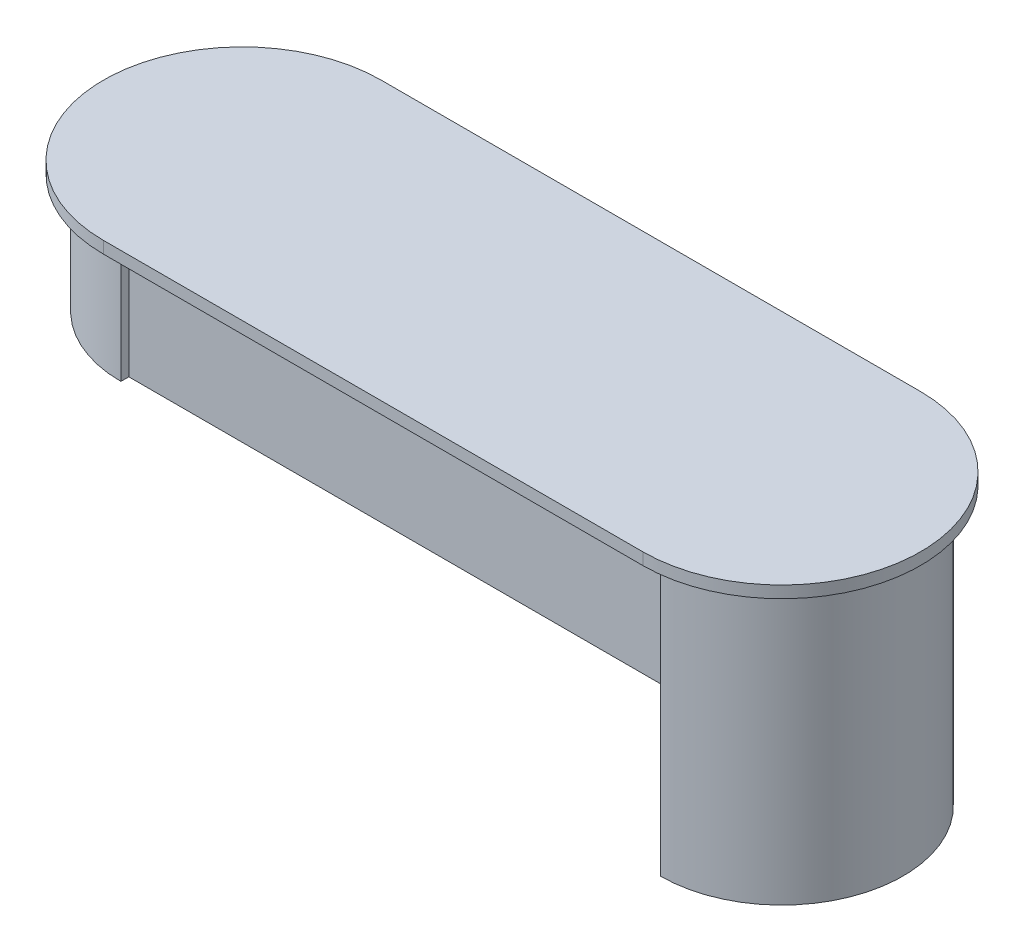
ISO-10303-21;
HEADER;
FILE_DESCRIPTION(('STEP AP214'),'2;1');
FILE_NAME('part.step','',(''),(''),'','','');
FILE_SCHEMA(('AUTOMOTIVE_DESIGN { 1 0 10303 214 1 1 1 1 }'));
ENDSEC;
DATA;
#1=APPLICATION_CONTEXT('core data for automotive mechanical design processes');
#2=APPLICATION_PROTOCOL_DEFINITION('international standard','automotive_design',2000,#1);
#3=PRODUCT_CONTEXT('',#1,'mechanical');
#4=PRODUCT('Part','Part','',(#3));
#5=PRODUCT_RELATED_PRODUCT_CATEGORY('part','',(#4));
#6=PRODUCT_DEFINITION_FORMATION('','',#4);
#7=PRODUCT_DEFINITION_CONTEXT('part definition',#1,'design');
#8=PRODUCT_DEFINITION('design','',#6,#7);
#9=PRODUCT_DEFINITION_SHAPE('','',#8);
#10=(LENGTH_UNIT() NAMED_UNIT(*) SI_UNIT(.MILLI.,.METRE.));
#11=(NAMED_UNIT(*) PLANE_ANGLE_UNIT() SI_UNIT($,.RADIAN.));
#12=(NAMED_UNIT(*) SI_UNIT($,.STERADIAN.) SOLID_ANGLE_UNIT());
#13=UNCERTAINTY_MEASURE_WITH_UNIT(LENGTH_MEASURE(1.E-05),#10,'distance_accuracy_value','');
#14=(GEOMETRIC_REPRESENTATION_CONTEXT(3) GLOBAL_UNCERTAINTY_ASSIGNED_CONTEXT((#13)) GLOBAL_UNIT_ASSIGNED_CONTEXT((#10,
#11,#12)) REPRESENTATION_CONTEXT('',''));
#15=CARTESIAN_POINT('',(0.,0.,0.));
#16=DIRECTION('',(0.,0.,1.));
#17=DIRECTION('',(1.,0.,0.));
#18=AXIS2_PLACEMENT_3D('',#15,#16,#17);
#19=CARTESIAN_POINT('',(2.,-6.21111906181165,-2.26));
#20=DIRECTION('',(-1.,0.,0.));
#21=DIRECTION('',(0.,0.,1.));
#22=AXIS2_PLACEMENT_3D('',#19,#20,#21);
#23=PLANE('',#22);
#24=DIRECTION('',(0.,0.,-1.));
#25=VECTOR('',#24,1.);
#26=CARTESIAN_POINT('',(2.,1.2,4.80558441227156));
#27=LINE('',#26,#25);
#28=CARTESIAN_POINT('',(2.,1.2,2.26));
#29=VERTEX_POINT('',#28);
#30=CARTESIAN_POINT('',(2.,1.2,-2.26));
#31=VERTEX_POINT('',#30);
#32=EDGE_CURVE('E276',#29,#31,#27,.T.);
#33=ORIENTED_EDGE('',*,*,#32,.F.);
#34=DIRECTION('',(0.,1.,0.));
#35=VECTOR('',#34,1.);
#36=CARTESIAN_POINT('',(2.,-6.21111906181165,2.26));
#37=LINE('',#36,#35);
#38=CARTESIAN_POINT('',(2.,0.5,2.26));
#39=VERTEX_POINT('',#38);
#40=EDGE_CURVE('E284',#39,#29,#37,.T.);
#41=ORIENTED_EDGE('',*,*,#40,.F.);
#42=DIRECTION('',(0.,0.,-1.));
#43=VECTOR('',#42,1.);
#44=CARTESIAN_POINT('',(2.,0.5,-2.26));
#45=LINE('',#44,#43);
#46=CARTESIAN_POINT('',(2.,0.5,-2.26));
#47=VERTEX_POINT('',#46);
#48=EDGE_CURVE('E285',#39,#47,#45,.T.);
#49=ORIENTED_EDGE('',*,*,#48,.T.);
#50=DIRECTION('',(0.,1.,0.));
#51=VECTOR('',#50,1.);
#52=CARTESIAN_POINT('',(2.,-6.21111906181165,-2.26));
#53=LINE('',#52,#51);
#54=EDGE_CURVE('E294',#47,#31,#53,.T.);
#55=ORIENTED_EDGE('',*,*,#54,.T.);
#56=EDGE_LOOP('',(#33,#41,#49,#55));
#57=FACE_BOUND('',#56,.T.);
#58=ADVANCED_FACE('F61',(#57),#23,.F.);
#59=CARTESIAN_POINT('',(0.,3.,0.));
#60=DIRECTION('',(0.,-1.,0.));
#61=DIRECTION('',(0.,0.,-1.));
#62=AXIS2_PLACEMENT_3D('',#59,#60,#61);
#63=CYLINDRICAL_SURFACE('',#62,2.26);
#64=DIRECTION('',(0.,-1.,0.));
#65=VECTOR('',#64,1.);
#66=CARTESIAN_POINT('',(0.,3.,-2.26));
#67=LINE('',#66,#65);
#68=CARTESIAN_POINT('',(0.,0.5,-2.26));
#69=VERTEX_POINT('',#68);
#70=CARTESIAN_POINT('',(0.,0.,-2.26));
#71=VERTEX_POINT('',#70);
#72=EDGE_CURVE('E336',#69,#71,#67,.T.);
#73=ORIENTED_EDGE('',*,*,#72,.F.);
#74=CARTESIAN_POINT('',(0.,0.5,0.));
#75=DIRECTION('',(0.,1.,0.));
#76=DIRECTION('',(0.,0.,1.));
#77=AXIS2_PLACEMENT_3D('',#74,#75,#76);
#78=CIRCLE('',#77,2.26);
#79=CARTESIAN_POINT('',(0.,0.5,2.26));
#80=VERTEX_POINT('',#79);
#81=EDGE_CURVE('E290',#69,#80,#78,.T.);
#82=ORIENTED_EDGE('',*,*,#81,.T.);
#83=DIRECTION('',(0.,-1.,0.));
#84=VECTOR('',#83,1.);
#85=CARTESIAN_POINT('',(0.,3.,2.26));
#86=LINE('',#85,#84);
#87=CARTESIAN_POINT('',(0.,0.,2.26));
#88=VERTEX_POINT('',#87);
#89=EDGE_CURVE('E227',#80,#88,#86,.T.);
#90=ORIENTED_EDGE('',*,*,#89,.T.);
#91=CARTESIAN_POINT('',(0.,0.,0.));
#92=DIRECTION('',(0.,1.,0.));
#93=DIRECTION('',(1.,0.,0.));
#94=AXIS2_PLACEMENT_3D('',#91,#92,#93);
#95=CIRCLE('',#94,2.26);
#96=EDGE_CURVE('E327',#71,#88,#95,.T.);
#97=ORIENTED_EDGE('',*,*,#96,.F.);
#98=EDGE_LOOP('',(#73,#82,#90,#97));
#99=FACE_BOUND('',#98,.T.);
#100=ADVANCED_FACE('F354',(#99),#63,.F.);
#101=CARTESIAN_POINT('',(0.,3.,2.26));
#102=DIRECTION('',(0.,0.,-1.));
#103=DIRECTION('',(-1.,0.,0.));
#104=AXIS2_PLACEMENT_3D('',#101,#102,#103);
#105=PLANE('',#104);
#106=DIRECTION('',(1.,0.,0.));
#107=VECTOR('',#106,1.);
#108=CARTESIAN_POINT('',(2.,0.5,2.26));
#109=LINE('',#108,#107);
#110=EDGE_CURVE('E84',#80,#39,#109,.T.);
#111=ORIENTED_EDGE('',*,*,#110,.T.);
#112=ORIENTED_EDGE('',*,*,#40,.T.);
#113=DIRECTION('',(-0.707106781186544,0.707106781186551,0.));
#114=VECTOR('',#113,1.);
#115=CARTESIAN_POINT('',(0.200000000000019,3.,2.26));
#116=LINE('',#115,#114);
#117=CARTESIAN_POINT('',(0.200000000000019,3.,2.26));
#118=VERTEX_POINT('',#117);
#119=EDGE_CURVE('E281',#29,#118,#116,.T.);
#120=ORIENTED_EDGE('',*,*,#119,.T.);
#121=DIRECTION('',(1.,0.,0.));
#122=VECTOR('',#121,1.);
#123=CARTESIAN_POINT('',(0.,3.,2.26));
#124=LINE('',#123,#122);
#125=CARTESIAN_POINT('',(13.6,3.,2.26));
#126=VERTEX_POINT('',#125);
#127=EDGE_CURVE('E328',#118,#126,#124,.T.);
#128=ORIENTED_EDGE('',*,*,#127,.T.);
#129=DIRECTION('',(0.,-1.,0.));
#130=VECTOR('',#129,1.);
#131=CARTESIAN_POINT('',(13.6,3.,2.26));
#132=LINE('',#131,#130);
#133=CARTESIAN_POINT('',(13.6,0.,2.26));
#134=VERTEX_POINT('',#133);
#135=EDGE_CURVE('E347',#126,#134,#132,.T.);
#136=ORIENTED_EDGE('',*,*,#135,.T.);
#137=DIRECTION('',(1.,0.,0.));
#138=VECTOR('',#137,1.);
#139=CARTESIAN_POINT('',(0.,0.,2.26));
#140=LINE('',#139,#138);
#141=EDGE_CURVE('E339',#88,#134,#140,.T.);
#142=ORIENTED_EDGE('',*,*,#141,.F.);
#143=ORIENTED_EDGE('',*,*,#89,.F.);
#144=EDGE_LOOP('',(#111,#112,#120,#128,#136,#142,#143));
#145=FACE_BOUND('',#144,.T.);
#146=ADVANCED_FACE('F356',(#145),#105,.T.);
#147=CARTESIAN_POINT('',(0.,3.,-2.26));
#148=DIRECTION('',(0.,0.,1.));
#149=DIRECTION('',(1.,0.,0.));
#150=AXIS2_PLACEMENT_3D('',#147,#148,#149);
#151=PLANE('',#150);
#152=DIRECTION('',(-1.,0.,0.));
#153=VECTOR('',#152,1.);
#154=CARTESIAN_POINT('',(0.,3.,-2.26));
#155=LINE('',#154,#153);
#156=CARTESIAN_POINT('',(13.6,3.,-2.26));
#157=VERTEX_POINT('',#156);
#158=CARTESIAN_POINT('',(0.200000000000019,3.,-2.26));
#159=VERTEX_POINT('',#158);
#160=EDGE_CURVE('E334',#157,#159,#155,.T.);
#161=ORIENTED_EDGE('',*,*,#160,.T.);
#162=DIRECTION('',(0.707106781186544,-0.707106781186551,0.));
#163=VECTOR('',#162,1.);
#164=CARTESIAN_POINT('',(0.200000000000019,3.,-2.26));
#165=LINE('',#164,#163);
#166=EDGE_CURVE('E273',#159,#31,#165,.T.);
#167=ORIENTED_EDGE('',*,*,#166,.T.);
#168=ORIENTED_EDGE('',*,*,#54,.F.);
#169=DIRECTION('',(-1.,0.,0.));
#170=VECTOR('',#169,1.);
#171=CARTESIAN_POINT('',(0.,0.5,-2.26));
#172=LINE('',#171,#170);
#173=EDGE_CURVE('E288',#47,#69,#172,.T.);
#174=ORIENTED_EDGE('',*,*,#173,.T.);
#175=ORIENTED_EDGE('',*,*,#72,.T.);
#176=DIRECTION('',(-1.,0.,0.));
#177=VECTOR('',#176,1.);
#178=CARTESIAN_POINT('',(0.,0.,-2.26));
#179=LINE('',#178,#177);
#180=CARTESIAN_POINT('',(13.6,0.,-2.26));
#181=VERTEX_POINT('',#180);
#182=EDGE_CURVE('E331',#181,#71,#179,.T.);
#183=ORIENTED_EDGE('',*,*,#182,.F.);
#184=DIRECTION('',(0.,-1.,0.));
#185=VECTOR('',#184,1.);
#186=CARTESIAN_POINT('',(13.6,3.,-2.26));
#187=LINE('',#186,#185);
#188=EDGE_CURVE('E345',#157,#181,#187,.T.);
#189=ORIENTED_EDGE('',*,*,#188,.F.);
#190=EDGE_LOOP('',(#161,#167,#168,#174,#175,#183,#189));
#191=FACE_BOUND('',#190,.T.);
#192=ADVANCED_FACE('F364',(#191),#151,.T.);
#193=CARTESIAN_POINT('',(0.,0.,0.));
#194=DIRECTION('',(0.,1.,0.));
#195=DIRECTION('',(0.,0.,1.));
#196=AXIS2_PLACEMENT_3D('',#193,#194,#195);
#197=PLANE('',#196);
#198=DIRECTION('',(1.,0.,0.));
#199=VECTOR('',#198,1.);
#200=CARTESIAN_POINT('',(13.6,0.,2.86));
#201=LINE('',#200,#199);
#202=CARTESIAN_POINT('',(0.,0.,2.86));
#203=VERTEX_POINT('',#202);
#204=CARTESIAN_POINT('',(13.6,0.,2.86));
#205=VERTEX_POINT('',#204);
#206=EDGE_CURVE('E76',#203,#205,#201,.T.);
#207=ORIENTED_EDGE('',*,*,#206,.F.);
#208=DIRECTION('',(0.,0.,-1.));
#209=VECTOR('',#208,1.);
#210=CARTESIAN_POINT('',(0.,0.,3.06));
#211=LINE('',#210,#209);
#212=CARTESIAN_POINT('',(0.,0.,3.06));
#213=VERTEX_POINT('',#212);
#214=EDGE_CURVE('E381',#213,#203,#211,.T.);
#215=ORIENTED_EDGE('',*,*,#214,.F.);
#216=CARTESIAN_POINT('',(0.,0.,0.));
#217=DIRECTION('',(0.,1.,0.));
#218=DIRECTION('',(0.,0.,1.));
#219=AXIS2_PLACEMENT_3D('',#216,#217,#218);
#220=CIRCLE('',#219,3.06);
#221=CARTESIAN_POINT('',(0.,0.,-3.06));
#222=VERTEX_POINT('',#221);
#223=EDGE_CURVE('E216',#222,#213,#220,.T.);
#224=ORIENTED_EDGE('',*,*,#223,.F.);
#225=DIRECTION('',(0.,0.,-1.));
#226=VECTOR('',#225,1.);
#227=CARTESIAN_POINT('',(0.,0.,-3.06));
#228=LINE('',#227,#226);
#229=CARTESIAN_POINT('',(0.,0.,-2.86));
#230=VERTEX_POINT('',#229);
#231=EDGE_CURVE('E391',#230,#222,#228,.T.);
#232=ORIENTED_EDGE('',*,*,#231,.F.);
#233=DIRECTION('',(-1.,0.,0.));
#234=VECTOR('',#233,1.);
#235=CARTESIAN_POINT('',(13.6,0.,-2.86));
#236=LINE('',#235,#234);
#237=CARTESIAN_POINT('',(13.6,0.,-2.86));
#238=VERTEX_POINT('',#237);
#239=EDGE_CURVE('E394',#238,#230,#236,.T.);
#240=ORIENTED_EDGE('',*,*,#239,.F.);
#241=DIRECTION('',(0.,0.,1.));
#242=VECTOR('',#241,1.);
#243=CARTESIAN_POINT('',(13.6,0.,-3.06));
#244=LINE('',#243,#242);
#245=EDGE_CURVE('E253',#238,#181,#244,.T.);
#246=ORIENTED_EDGE('',*,*,#245,.T.);
#247=ORIENTED_EDGE('',*,*,#182,.T.);
#248=ORIENTED_EDGE('',*,*,#96,.T.);
#249=ORIENTED_EDGE('',*,*,#141,.T.);
#250=DIRECTION('',(0.,0.,1.));
#251=VECTOR('',#250,1.);
#252=CARTESIAN_POINT('',(13.6,0.,2.26));
#253=LINE('',#252,#251);
#254=EDGE_CURVE('E265',#134,#205,#253,.T.);
#255=ORIENTED_EDGE('',*,*,#254,.T.);
#256=EDGE_LOOP('',(#207,#215,#224,#232,#240,#246,#247,#248,#249,#255));
#257=FACE_BOUND('',#256,.T.);
#258=ADVANCED_FACE('F358',(#257),#197,.F.);
#259=CARTESIAN_POINT('',(0.,3.,0.));
#260=DIRECTION('',(0.,-1.,0.));
#261=DIRECTION('',(0.,0.,-1.));
#262=AXIS2_PLACEMENT_3D('',#259,#260,#261);
#263=CYLINDRICAL_SURFACE('',#262,3.06);
#264=ORIENTED_EDGE('',*,*,#223,.T.);
#265=DIRECTION('',(0.,-1.,0.));
#266=VECTOR('',#265,1.);
#267=CARTESIAN_POINT('',(0.,3.,3.06));
#268=LINE('',#267,#266);
#269=CARTESIAN_POINT('',(0.,3.,3.06));
#270=VERTEX_POINT('',#269);
#271=EDGE_CURVE('E13',#270,#213,#268,.T.);
#272=ORIENTED_EDGE('',*,*,#271,.F.);
#273=CARTESIAN_POINT('',(0.,3.,0.));
#274=DIRECTION('',(0.,1.,0.));
#275=DIRECTION('',(0.,0.,1.));
#276=AXIS2_PLACEMENT_3D('',#273,#274,#275);
#277=CIRCLE('',#276,3.06);
#278=CARTESIAN_POINT('',(0.,3.,-3.06));
#279=VERTEX_POINT('',#278);
#280=EDGE_CURVE('E214',#279,#270,#277,.T.);
#281=ORIENTED_EDGE('',*,*,#280,.F.);
#282=DIRECTION('',(0.,-1.,0.));
#283=VECTOR('',#282,1.);
#284=CARTESIAN_POINT('',(0.,3.,-3.06));
#285=LINE('',#284,#283);
#286=EDGE_CURVE('E225',#279,#222,#285,.T.);
#287=ORIENTED_EDGE('',*,*,#286,.T.);
#288=EDGE_LOOP('',(#264,#272,#281,#287));
#289=FACE_BOUND('',#288,.T.);
#290=ADVANCED_FACE('F63',(#289),#263,.T.);
#291=CARTESIAN_POINT('',(13.6,3.,0.));
#292=DIRECTION('',(0.,-1.,0.));
#293=DIRECTION('',(0.,0.,-1.));
#294=AXIS2_PLACEMENT_3D('',#291,#292,#293);
#295=CYLINDRICAL_SURFACE('',#294,3.06);
#296=DIRECTION('',(0.,-1.,0.));
#297=VECTOR('',#296,1.);
#298=CARTESIAN_POINT('',(13.6,3.,3.06));
#299=LINE('',#298,#297);
#300=CARTESIAN_POINT('',(13.6,3.,3.06));
#301=VERTEX_POINT('',#300);
#302=CARTESIAN_POINT('',(13.6,-4.,3.06));
#303=VERTEX_POINT('',#302);
#304=EDGE_CURVE('E69',#301,#303,#299,.T.);
#305=ORIENTED_EDGE('',*,*,#304,.T.);
#306=CARTESIAN_POINT('',(13.6,-4.,0.));
#307=DIRECTION('',(0.,-1.,0.));
#308=DIRECTION('',(1.,0.,0.));
#309=AXIS2_PLACEMENT_3D('',#306,#307,#308);
#310=CIRCLE('',#309,3.06);
#311=CARTESIAN_POINT('',(13.6,-4.,-3.06));
#312=VERTEX_POINT('',#311);
#313=EDGE_CURVE('E241',#312,#303,#310,.T.);
#314=ORIENTED_EDGE('',*,*,#313,.F.);
#315=DIRECTION('',(0.,-1.,0.));
#316=VECTOR('',#315,1.);
#317=CARTESIAN_POINT('',(13.6,3.,-3.06));
#318=LINE('',#317,#316);
#319=CARTESIAN_POINT('',(13.6,3.,-3.06));
#320=VERTEX_POINT('',#319);
#321=EDGE_CURVE('E233',#320,#312,#318,.T.);
#322=ORIENTED_EDGE('',*,*,#321,.F.);
#323=CARTESIAN_POINT('',(13.6,3.,0.));
#324=DIRECTION('',(0.,1.,0.));
#325=DIRECTION('',(0.,0.,1.));
#326=AXIS2_PLACEMENT_3D('',#323,#324,#325);
#327=CIRCLE('',#326,3.06);
#328=EDGE_CURVE('E223',#301,#320,#327,.T.);
#329=ORIENTED_EDGE('',*,*,#328,.F.);
#330=EDGE_LOOP('',(#305,#314,#322,#329));
#331=FACE_BOUND('',#330,.T.);
#332=ADVANCED_FACE('F239',(#331),#295,.T.);
#333=CARTESIAN_POINT('',(13.6,3.,0.));
#334=DIRECTION('',(0.,-1.,0.));
#335=DIRECTION('',(0.,0.,-1.));
#336=AXIS2_PLACEMENT_3D('',#333,#334,#335);
#337=CYLINDRICAL_SURFACE('',#336,2.26);
#338=ORIENTED_EDGE('',*,*,#188,.T.);
#339=DIRECTION('',(0.,1.,0.));
#340=VECTOR('',#339,1.);
#341=CARTESIAN_POINT('',(13.6,-4.,-2.26));
#342=LINE('',#341,#340);
#343=CARTESIAN_POINT('',(13.6,-4.,-2.26));
#344=VERTEX_POINT('',#343);
#345=EDGE_CURVE('E264',#344,#181,#342,.T.);
#346=ORIENTED_EDGE('',*,*,#345,.F.);
#347=CARTESIAN_POINT('',(13.6,-4.,0.));
#348=DIRECTION('',(0.,-1.,0.));
#349=DIRECTION('',(0.,0.,-1.));
#350=AXIS2_PLACEMENT_3D('',#347,#348,#349);
#351=CIRCLE('',#350,2.26);
#352=CARTESIAN_POINT('',(13.6,-4.,2.26));
#353=VERTEX_POINT('',#352);
#354=EDGE_CURVE('E258',#344,#353,#351,.T.);
#355=ORIENTED_EDGE('',*,*,#354,.T.);
#356=DIRECTION('',(0.,1.,0.));
#357=VECTOR('',#356,1.);
#358=CARTESIAN_POINT('',(13.6,-4.,2.26));
#359=LINE('',#358,#357);
#360=EDGE_CURVE('E257',#353,#134,#359,.T.);
#361=ORIENTED_EDGE('',*,*,#360,.T.);
#362=ORIENTED_EDGE('',*,*,#135,.F.);
#363=CARTESIAN_POINT('',(13.6,3.,0.));
#364=DIRECTION('',(0.,1.,0.));
#365=DIRECTION('',(1.,0.,0.));
#366=AXIS2_PLACEMENT_3D('',#363,#364,#365);
#367=CIRCLE('',#366,2.26);
#368=EDGE_CURVE('E330',#126,#157,#367,.T.);
#369=ORIENTED_EDGE('',*,*,#368,.T.);
#370=EDGE_LOOP('',(#338,#346,#355,#361,#362,#369));
#371=FACE_BOUND('',#370,.T.);
#372=ADVANCED_FACE('F379',(#371),#337,.F.);
#373=CARTESIAN_POINT('',(0.,3.,0.));
#374=DIRECTION('',(0.,1.,0.));
#375=DIRECTION('',(0.,0.,1.));
#376=AXIS2_PLACEMENT_3D('',#373,#374,#375);
#377=PLANE('',#376);
#378=ORIENTED_EDGE('',*,*,#127,.F.);
#379=DIRECTION('',(0.,0.,-1.));
#380=VECTOR('',#379,1.);
#381=CARTESIAN_POINT('',(0.200000000000019,3.,4.80558441227156));
#382=LINE('',#381,#380);
#383=EDGE_CURVE('E278',#118,#159,#382,.T.);
#384=ORIENTED_EDGE('',*,*,#383,.T.);
#385=ORIENTED_EDGE('',*,*,#160,.F.);
#386=ORIENTED_EDGE('',*,*,#368,.F.);
#387=EDGE_LOOP('',(#378,#384,#385,#386));
#388=FACE_BOUND('',#387,.T.);
#389=ADVANCED_FACE('F377',(#388),#377,.F.);
#390=CARTESIAN_POINT('',(0.,3.3,0.));
#391=DIRECTION('',(0.,-1.,0.));
#392=DIRECTION('',(0.,0.,-1.));
#393=AXIS2_PLACEMENT_3D('',#390,#391,#392);
#394=CYLINDRICAL_SURFACE('',#393,3.5);
#395=CARTESIAN_POINT('',(0.,3.,0.));
#396=DIRECTION('',(0.,1.,0.));
#397=DIRECTION('',(0.,0.,1.));
#398=AXIS2_PLACEMENT_3D('',#395,#396,#397);
#399=CIRCLE('',#398,3.5);
#400=CARTESIAN_POINT('',(0.,3.,-3.5));
#401=VERTEX_POINT('',#400);
#402=CARTESIAN_POINT('',(0.,3.,3.5));
#403=VERTEX_POINT('',#402);
#404=EDGE_CURVE('E292',#401,#403,#399,.T.);
#405=ORIENTED_EDGE('',*,*,#404,.T.);
#406=DIRECTION('',(0.,-1.,0.));
#407=VECTOR('',#406,1.);
#408=CARTESIAN_POINT('',(0.,3.3,3.5));
#409=LINE('',#408,#407);
#410=CARTESIAN_POINT('',(0.,3.3,3.5));
#411=VERTEX_POINT('',#410);
#412=EDGE_CURVE('E324',#411,#403,#409,.T.);
#413=ORIENTED_EDGE('',*,*,#412,.F.);
#414=CARTESIAN_POINT('',(0.,3.3,0.));
#415=DIRECTION('',(0.,1.,0.));
#416=DIRECTION('',(0.,0.,1.));
#417=AXIS2_PLACEMENT_3D('',#414,#415,#416);
#418=CIRCLE('',#417,3.5);
#419=CARTESIAN_POINT('',(0.,3.3,-3.5));
#420=VERTEX_POINT('',#419);
#421=EDGE_CURVE('E298',#420,#411,#418,.T.);
#422=ORIENTED_EDGE('',*,*,#421,.F.);
#423=DIRECTION('',(0.,-1.,0.));
#424=VECTOR('',#423,1.);
#425=CARTESIAN_POINT('',(0.,3.3,-3.5));
#426=LINE('',#425,#424);
#427=EDGE_CURVE('E308',#420,#401,#426,.T.);
#428=ORIENTED_EDGE('',*,*,#427,.T.);
#429=EDGE_LOOP('',(#405,#413,#422,#428));
#430=FACE_BOUND('',#429,.T.);
#431=ADVANCED_FACE('F444',(#430),#394,.T.);
#432=CARTESIAN_POINT('',(0.,3.3,3.5));
#433=DIRECTION('',(0.,0.,-1.));
#434=DIRECTION('',(-1.,0.,0.));
#435=AXIS2_PLACEMENT_3D('',#432,#433,#434);
#436=PLANE('',#435);
#437=DIRECTION('',(1.,0.,0.));
#438=VECTOR('',#437,1.);
#439=CARTESIAN_POINT('',(0.,3.,3.5));
#440=LINE('',#439,#438);
#441=CARTESIAN_POINT('',(13.6,3.,3.5));
#442=VERTEX_POINT('',#441);
#443=EDGE_CURVE('E311',#403,#442,#440,.T.);
#444=ORIENTED_EDGE('',*,*,#443,.T.);
#445=DIRECTION('',(0.,-1.,0.));
#446=VECTOR('',#445,1.);
#447=CARTESIAN_POINT('',(13.6,3.3,3.5));
#448=LINE('',#447,#446);
#449=CARTESIAN_POINT('',(13.6,3.3,3.5));
#450=VERTEX_POINT('',#449);
#451=EDGE_CURVE('E321',#450,#442,#448,.T.);
#452=ORIENTED_EDGE('',*,*,#451,.F.);
#453=DIRECTION('',(1.,0.,0.));
#454=VECTOR('',#453,1.);
#455=CARTESIAN_POINT('',(0.,3.3,3.5));
#456=LINE('',#455,#454);
#457=EDGE_CURVE('E301',#411,#450,#456,.T.);
#458=ORIENTED_EDGE('',*,*,#457,.F.);
#459=ORIENTED_EDGE('',*,*,#412,.T.);
#460=EDGE_LOOP('',(#444,#452,#458,#459));
#461=FACE_BOUND('',#460,.T.);
#462=ADVANCED_FACE('F440',(#461),#436,.F.);
#463=CARTESIAN_POINT('',(13.6,3.3,0.));
#464=DIRECTION('',(0.,-1.,0.));
#465=DIRECTION('',(0.,0.,-1.));
#466=AXIS2_PLACEMENT_3D('',#463,#464,#465);
#467=CYLINDRICAL_SURFACE('',#466,3.5);
#468=CARTESIAN_POINT('',(13.6,3.,0.));
#469=DIRECTION('',(0.,1.,0.));
#470=DIRECTION('',(0.,0.,1.));
#471=AXIS2_PLACEMENT_3D('',#468,#469,#470);
#472=CIRCLE('',#471,3.5);
#473=CARTESIAN_POINT('',(13.6,3.,-3.5));
#474=VERTEX_POINT('',#473);
#475=EDGE_CURVE('E313',#442,#474,#472,.T.);
#476=ORIENTED_EDGE('',*,*,#475,.T.);
#477=DIRECTION('',(0.,-1.,0.));
#478=VECTOR('',#477,1.);
#479=CARTESIAN_POINT('',(13.6,3.3,-3.5));
#480=LINE('',#479,#478);
#481=CARTESIAN_POINT('',(13.6,3.3,-3.5));
#482=VERTEX_POINT('',#481);
#483=EDGE_CURVE('E318',#482,#474,#480,.T.);
#484=ORIENTED_EDGE('',*,*,#483,.F.);
#485=CARTESIAN_POINT('',(13.6,3.3,0.));
#486=DIRECTION('',(0.,1.,0.));
#487=DIRECTION('',(0.,0.,1.));
#488=AXIS2_PLACEMENT_3D('',#485,#486,#487);
#489=CIRCLE('',#488,3.5);
#490=EDGE_CURVE('E304',#450,#482,#489,.T.);
#491=ORIENTED_EDGE('',*,*,#490,.F.);
#492=ORIENTED_EDGE('',*,*,#451,.T.);
#493=EDGE_LOOP('',(#476,#484,#491,#492));
#494=FACE_BOUND('',#493,.T.);
#495=ADVANCED_FACE('F436',(#494),#467,.T.);
#496=CARTESIAN_POINT('',(0.,3.3,-3.5));
#497=DIRECTION('',(0.,0.,1.));
#498=DIRECTION('',(1.,0.,0.));
#499=AXIS2_PLACEMENT_3D('',#496,#497,#498);
#500=PLANE('',#499);
#501=DIRECTION('',(-1.,0.,0.));
#502=VECTOR('',#501,1.);
#503=CARTESIAN_POINT('',(0.,3.,-3.5));
#504=LINE('',#503,#502);
#505=EDGE_CURVE('E302',#474,#401,#504,.T.);
#506=ORIENTED_EDGE('',*,*,#505,.T.);
#507=ORIENTED_EDGE('',*,*,#427,.F.);
#508=DIRECTION('',(-1.,0.,0.));
#509=VECTOR('',#508,1.);
#510=CARTESIAN_POINT('',(0.,3.3,-3.5));
#511=LINE('',#510,#509);
#512=EDGE_CURVE('E306',#482,#420,#511,.T.);
#513=ORIENTED_EDGE('',*,*,#512,.F.);
#514=ORIENTED_EDGE('',*,*,#483,.T.);
#515=EDGE_LOOP('',(#506,#507,#513,#514));
#516=FACE_BOUND('',#515,.T.);
#517=ADVANCED_FACE('F430',(#516),#500,.F.);
#518=CARTESIAN_POINT('',(0.,3.3,0.));
#519=DIRECTION('',(0.,1.,0.));
#520=DIRECTION('',(0.,0.,1.));
#521=AXIS2_PLACEMENT_3D('',#518,#519,#520);
#522=PLANE('',#521);
#523=ORIENTED_EDGE('',*,*,#421,.T.);
#524=ORIENTED_EDGE('',*,*,#457,.T.);
#525=ORIENTED_EDGE('',*,*,#490,.T.);
#526=ORIENTED_EDGE('',*,*,#512,.T.);
#527=EDGE_LOOP('',(#523,#524,#525,#526));
#528=FACE_BOUND('',#527,.T.);
#529=ADVANCED_FACE('F427',(#528),#522,.T.);
#530=ORIENTED_EDGE('',*,*,#328,.T.);
#531=DIRECTION('',(0.,0.,1.));
#532=VECTOR('',#531,1.);
#533=CARTESIAN_POINT('',(13.6,3.,-3.06));
#534=LINE('',#533,#532);
#535=CARTESIAN_POINT('',(13.6,3.,-2.86));
#536=VERTEX_POINT('',#535);
#537=EDGE_CURVE('E399',#320,#536,#534,.T.);
#538=ORIENTED_EDGE('',*,*,#537,.T.);
#539=DIRECTION('',(-1.,0.,0.));
#540=VECTOR('',#539,1.);
#541=CARTESIAN_POINT('',(13.6,3.,-2.86));
#542=LINE('',#541,#540);
#543=CARTESIAN_POINT('',(0.,3.,-2.86));
#544=VERTEX_POINT('',#543);
#545=EDGE_CURVE('E393',#536,#544,#542,.T.);
#546=ORIENTED_EDGE('',*,*,#545,.T.);
#547=DIRECTION('',(0.,0.,-1.));
#548=VECTOR('',#547,1.);
#549=CARTESIAN_POINT('',(0.,3.,-3.06));
#550=LINE('',#549,#548);
#551=EDGE_CURVE('E222',#544,#279,#550,.T.);
#552=ORIENTED_EDGE('',*,*,#551,.T.);
#553=ORIENTED_EDGE('',*,*,#280,.T.);
#554=DIRECTION('',(0.,0.,-1.));
#555=VECTOR('',#554,1.);
#556=CARTESIAN_POINT('',(0.,3.,3.06));
#557=LINE('',#556,#555);
#558=CARTESIAN_POINT('',(0.,3.,2.86));
#559=VERTEX_POINT('',#558);
#560=EDGE_CURVE('E200',#270,#559,#557,.T.);
#561=ORIENTED_EDGE('',*,*,#560,.T.);
#562=DIRECTION('',(1.,0.,0.));
#563=VECTOR('',#562,1.);
#564=CARTESIAN_POINT('',(13.6,3.,2.86));
#565=LINE('',#564,#563);
#566=CARTESIAN_POINT('',(13.6,3.,2.86));
#567=VERTEX_POINT('',#566);
#568=EDGE_CURVE('E387',#559,#567,#565,.T.);
#569=ORIENTED_EDGE('',*,*,#568,.T.);
#570=DIRECTION('',(0.,0.,1.));
#571=VECTOR('',#570,1.);
#572=CARTESIAN_POINT('',(13.6,3.,3.06));
#573=LINE('',#572,#571);
#574=EDGE_CURVE('E268',#567,#301,#573,.T.);
#575=ORIENTED_EDGE('',*,*,#574,.T.);
#576=EDGE_LOOP('',(#530,#538,#546,#552,#553,#561,#569,#575));
#577=FACE_BOUND('',#576,.T.);
#578=ORIENTED_EDGE('',*,*,#404,.F.);
#579=ORIENTED_EDGE('',*,*,#505,.F.);
#580=ORIENTED_EDGE('',*,*,#475,.F.);
#581=ORIENTED_EDGE('',*,*,#443,.F.);
#582=EDGE_LOOP('',(#578,#579,#580,#581));
#583=FACE_BOUND('',#582,.T.);
#584=ADVANCED_FACE('F219',(#577,#583),#377,.F.);
#585=CARTESIAN_POINT('',(0.,0.5,0.));
#586=DIRECTION('',(0.,1.,0.));
#587=DIRECTION('',(0.,0.,1.));
#588=AXIS2_PLACEMENT_3D('',#585,#586,#587);
#589=PLANE('',#588);
#590=ORIENTED_EDGE('',*,*,#173,.F.);
#591=ORIENTED_EDGE('',*,*,#48,.F.);
#592=ORIENTED_EDGE('',*,*,#110,.F.);
#593=ORIENTED_EDGE('',*,*,#81,.F.);
#594=EDGE_LOOP('',(#590,#591,#592,#593));
#595=FACE_BOUND('',#594,.T.);
#596=ADVANCED_FACE('F367',(#595),#589,.F.);
#597=CARTESIAN_POINT('',(0.200000000000019,3.,4.80558441227156));
#598=DIRECTION('',(0.707106781186551,0.707106781186544,0.));
#599=DIRECTION('',(-0.707106781186544,0.707106781186551,0.));
#600=AXIS2_PLACEMENT_3D('',#597,#598,#599);
#601=PLANE('',#600);
#602=ORIENTED_EDGE('',*,*,#32,.T.);
#603=ORIENTED_EDGE('',*,*,#166,.F.);
#604=ORIENTED_EDGE('',*,*,#383,.F.);
#605=ORIENTED_EDGE('',*,*,#119,.F.);
#606=EDGE_LOOP('',(#602,#603,#604,#605));
#607=FACE_BOUND('',#606,.T.);
#608=ADVANCED_FACE('F374',(#607),#601,.T.);
#609=CARTESIAN_POINT('',(13.6,-4.,2.26));
#610=DIRECTION('',(-1.,0.,0.));
#611=DIRECTION('',(0.,0.,1.));
#612=AXIS2_PLACEMENT_3D('',#609,#610,#611);
#613=PLANE('',#612);
#614=ORIENTED_EDGE('',*,*,#254,.F.);
#615=ORIENTED_EDGE('',*,*,#360,.F.);
#616=DIRECTION('',(0.,0.,1.));
#617=VECTOR('',#616,1.);
#618=CARTESIAN_POINT('',(13.6,-4.,2.26));
#619=LINE('',#618,#617);
#620=EDGE_CURVE('E249',#353,#303,#619,.T.);
#621=ORIENTED_EDGE('',*,*,#620,.T.);
#622=ORIENTED_EDGE('',*,*,#304,.F.);
#623=ORIENTED_EDGE('',*,*,#574,.F.);
#624=DIRECTION('',(0.,-1.,0.));
#625=VECTOR('',#624,1.);
#626=CARTESIAN_POINT('',(13.6,16.6014705087354,2.86));
#627=LINE('',#626,#625);
#628=EDGE_CURVE('E380',#567,#205,#627,.T.);
#629=ORIENTED_EDGE('',*,*,#628,.T.);
#630=EDGE_LOOP('',(#614,#615,#621,#622,#623,#629));
#631=FACE_BOUND('',#630,.T.);
#632=ADVANCED_FACE('F256',(#631),#613,.T.);
#633=CARTESIAN_POINT('',(13.6,-4.,-3.06));
#634=DIRECTION('',(-1.,0.,0.));
#635=DIRECTION('',(0.,0.,1.));
#636=AXIS2_PLACEMENT_3D('',#633,#634,#635);
#637=PLANE('',#636);
#638=ORIENTED_EDGE('',*,*,#245,.F.);
#639=DIRECTION('',(0.,-1.,0.));
#640=VECTOR('',#639,1.);
#641=CARTESIAN_POINT('',(13.6,16.6014705087354,-2.86));
#642=LINE('',#641,#640);
#643=EDGE_CURVE('E383',#536,#238,#642,.T.);
#644=ORIENTED_EDGE('',*,*,#643,.F.);
#645=ORIENTED_EDGE('',*,*,#537,.F.);
#646=ORIENTED_EDGE('',*,*,#321,.T.);
#647=DIRECTION('',(0.,0.,1.));
#648=VECTOR('',#647,1.);
#649=CARTESIAN_POINT('',(13.6,-4.,-3.06));
#650=LINE('',#649,#648);
#651=EDGE_CURVE('E252',#312,#344,#650,.T.);
#652=ORIENTED_EDGE('',*,*,#651,.T.);
#653=ORIENTED_EDGE('',*,*,#345,.T.);
#654=EDGE_LOOP('',(#638,#644,#645,#646,#652,#653));
#655=FACE_BOUND('',#654,.T.);
#656=ADVANCED_FACE('F409',(#655),#637,.T.);
#657=CARTESIAN_POINT('',(13.6,-4.,0.));
#658=DIRECTION('',(0.,-1.,0.));
#659=DIRECTION('',(1.,0.,0.));
#660=AXIS2_PLACEMENT_3D('',#657,#658,#659);
#661=PLANE('',#660);
#662=ORIENTED_EDGE('',*,*,#313,.T.);
#663=ORIENTED_EDGE('',*,*,#620,.F.);
#664=ORIENTED_EDGE('',*,*,#354,.F.);
#665=ORIENTED_EDGE('',*,*,#651,.F.);
#666=EDGE_LOOP('',(#662,#663,#664,#665));
#667=FACE_BOUND('',#666,.T.);
#668=ADVANCED_FACE('F247',(#667),#661,.T.);
#669=CARTESIAN_POINT('',(13.6,16.6014705087354,-2.86));
#670=DIRECTION('',(0.,0.,1.));
#671=DIRECTION('',(1.,0.,0.));
#672=AXIS2_PLACEMENT_3D('',#669,#670,#671);
#673=PLANE('',#672);
#674=ORIENTED_EDGE('',*,*,#643,.T.);
#675=ORIENTED_EDGE('',*,*,#239,.T.);
#676=DIRECTION('',(0.,-1.,0.));
#677=VECTOR('',#676,1.);
#678=CARTESIAN_POINT('',(0.,16.6014705087354,-2.86));
#679=LINE('',#678,#677);
#680=EDGE_CURVE('E398',#544,#230,#679,.T.);
#681=ORIENTED_EDGE('',*,*,#680,.F.);
#682=ORIENTED_EDGE('',*,*,#545,.F.);
#683=EDGE_LOOP('',(#674,#675,#681,#682));
#684=FACE_BOUND('',#683,.T.);
#685=ADVANCED_FACE('F405',(#684),#673,.F.);
#686=CARTESIAN_POINT('',(0.,16.6014705087354,-3.06));
#687=DIRECTION('',(-1.,0.,0.));
#688=DIRECTION('',(0.,0.,1.));
#689=AXIS2_PLACEMENT_3D('',#686,#687,#688);
#690=PLANE('',#689);
#691=ORIENTED_EDGE('',*,*,#680,.T.);
#692=ORIENTED_EDGE('',*,*,#231,.T.);
#693=ORIENTED_EDGE('',*,*,#286,.F.);
#694=ORIENTED_EDGE('',*,*,#551,.F.);
#695=EDGE_LOOP('',(#691,#692,#693,#694));
#696=FACE_BOUND('',#695,.T.);
#697=ADVANCED_FACE('F416',(#696),#690,.F.);
#698=CARTESIAN_POINT('',(0.,16.6014705087354,3.06));
#699=DIRECTION('',(-1.,0.,0.));
#700=DIRECTION('',(0.,0.,1.));
#701=AXIS2_PLACEMENT_3D('',#698,#699,#700);
#702=PLANE('',#701);
#703=ORIENTED_EDGE('',*,*,#271,.T.);
#704=ORIENTED_EDGE('',*,*,#214,.T.);
#705=DIRECTION('',(0.,-1.,0.));
#706=VECTOR('',#705,1.);
#707=CARTESIAN_POINT('',(0.,16.6014705087354,2.86));
#708=LINE('',#707,#706);
#709=EDGE_CURVE('E205',#559,#203,#708,.T.);
#710=ORIENTED_EDGE('',*,*,#709,.F.);
#711=ORIENTED_EDGE('',*,*,#560,.F.);
#712=EDGE_LOOP('',(#703,#704,#710,#711));
#713=FACE_BOUND('',#712,.T.);
#714=ADVANCED_FACE('F202',(#713),#702,.F.);
#715=CARTESIAN_POINT('',(13.6,16.6014705087354,2.86));
#716=DIRECTION('',(0.,0.,-1.));
#717=DIRECTION('',(-1.,0.,0.));
#718=AXIS2_PLACEMENT_3D('',#715,#716,#717);
#719=PLANE('',#718);
#720=ORIENTED_EDGE('',*,*,#709,.T.);
#721=ORIENTED_EDGE('',*,*,#206,.T.);
#722=ORIENTED_EDGE('',*,*,#628,.F.);
#723=ORIENTED_EDGE('',*,*,#568,.F.);
#724=EDGE_LOOP('',(#720,#721,#722,#723));
#725=FACE_BOUND('',#724,.T.);
#726=ADVANCED_FACE('F410',(#725),#719,.F.);
#727=CLOSED_SHELL('',(#58,#100,#146,#192,#258,#290,#332,#372,#389,#431,#462,#495,#517,#529,#584,
#596,#608,#632,#656,#668,#685,#697,#714,#726));
#728=MANIFOLD_SOLID_BREP('B2',#727);
#729=ADVANCED_BREP_SHAPE_REPRESENTATION('',(#18,#728),#14);
#730=SHAPE_DEFINITION_REPRESENTATION(#9,#729);
ENDSEC;
END-ISO-10303-21;
